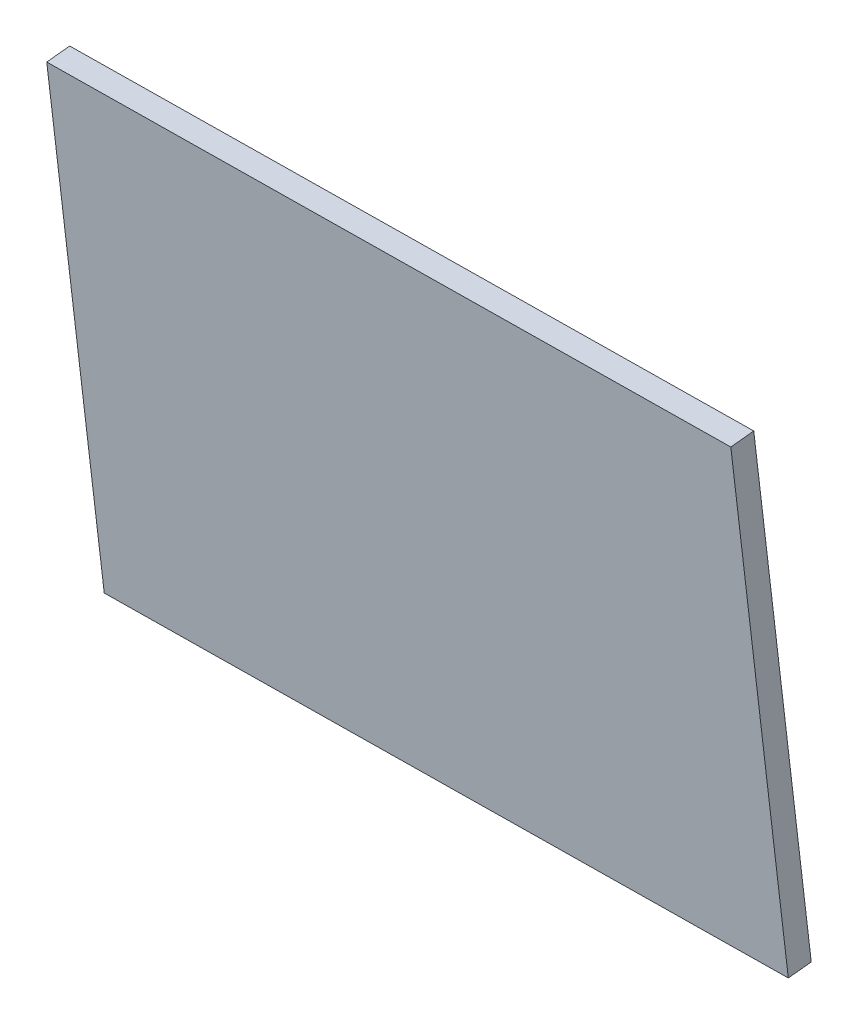
ISO-10303-21;
HEADER;
FILE_DESCRIPTION(('STEP AP214'),'2;1');
FILE_NAME('part.step','',(''),(''),'','','');
FILE_SCHEMA(('AUTOMOTIVE_DESIGN { 1 0 10303 214 1 1 1 1 }'));
ENDSEC;
DATA;
#1=APPLICATION_CONTEXT('core data for automotive mechanical design processes');
#2=APPLICATION_PROTOCOL_DEFINITION('international standard','automotive_design',2000,#1);
#3=PRODUCT_CONTEXT('',#1,'mechanical');
#4=PRODUCT('Part','Part','',(#3));
#5=PRODUCT_RELATED_PRODUCT_CATEGORY('part','',(#4));
#6=PRODUCT_DEFINITION_FORMATION('','',#4);
#7=PRODUCT_DEFINITION_CONTEXT('part definition',#1,'design');
#8=PRODUCT_DEFINITION('design','',#6,#7);
#9=PRODUCT_DEFINITION_SHAPE('','',#8);
#10=(LENGTH_UNIT() NAMED_UNIT(*) SI_UNIT(.MILLI.,.METRE.));
#11=(NAMED_UNIT(*) PLANE_ANGLE_UNIT() SI_UNIT($,.RADIAN.));
#12=(NAMED_UNIT(*) SI_UNIT($,.STERADIAN.) SOLID_ANGLE_UNIT());
#13=UNCERTAINTY_MEASURE_WITH_UNIT(LENGTH_MEASURE(1.E-05),#10,'distance_accuracy_value','');
#14=(GEOMETRIC_REPRESENTATION_CONTEXT(3) GLOBAL_UNCERTAINTY_ASSIGNED_CONTEXT((#13)) GLOBAL_UNIT_ASSIGNED_CONTEXT((#10,
#11,#12)) REPRESENTATION_CONTEXT('',''));
#15=CARTESIAN_POINT('',(0.,0.,0.));
#16=DIRECTION('',(0.,0.,1.));
#17=DIRECTION('',(1.,0.,0.));
#18=AXIS2_PLACEMENT_3D('',#15,#16,#17);
#19=CARTESIAN_POINT('',(442.900543352391,-883.331970053048,-294.85059116165));
#20=DIRECTION('',(0.999899544381668,0.0140963136781498,0.00148158226920728));
#21=DIRECTION('',(-0.0140963291494858,0.99990064181623,0.));
#22=AXIS2_PLACEMENT_3D('',#19,#20,#21);
#23=PLANE('',#22);
#24=DIRECTION('',(0.0141739601147041,-0.994421990056329,-0.104517962796242));
#25=VECTOR('',#24,1.);
#26=CARTESIAN_POINT('',(442.900543352391,-882.286685420371,-304.795810115332));
#27=LINE('',#26,#25);
#28=CARTESIAN_POINT('',(439.924011728303,-673.458067508544,-282.847037928122));
#29=VERTEX_POINT('',#28);
#30=CARTESIAN_POINT('',(442.900543352391,-882.286685420371,-304.795810115332));
#31=VERTEX_POINT('',#30);
#32=EDGE_CURVE('E103',#29,#31,#27,.T.);
#33=ORIENTED_EDGE('',*,*,#32,.F.);
#34=DIRECTION('',(0.,0.104528463267653,-0.994521895368273));
#35=VECTOR('',#34,1.);
#36=CARTESIAN_POINT('',(439.924011728303,-674.50335214122,-272.901818974439));
#37=LINE('',#36,#35);
#38=CARTESIAN_POINT('',(439.924011728303,-674.50335214122,-272.901818974439));
#39=VERTEX_POINT('',#38);
#40=EDGE_CURVE('E11',#39,#29,#37,.T.);
#41=ORIENTED_EDGE('',*,*,#40,.F.);
#42=DIRECTION('',(0.0141739601147041,-0.994421990056329,-0.104517962796242));
#43=VECTOR('',#42,1.);
#44=CARTESIAN_POINT('',(442.900543352391,-883.331970053048,-294.85059116165));
#45=LINE('',#44,#43);
#46=CARTESIAN_POINT('',(442.900543352391,-883.331970053048,-294.85059116165));
#47=VERTEX_POINT('',#46);
#48=EDGE_CURVE('E97',#39,#47,#45,.T.);
#49=ORIENTED_EDGE('',*,*,#48,.T.);
#50=DIRECTION('',(0.,0.104528463267653,-0.994521895368273));
#51=VECTOR('',#50,1.);
#52=CARTESIAN_POINT('',(442.900543352391,-883.331970053048,-294.85059116165));
#53=LINE('',#52,#51);
#54=EDGE_CURVE('E42',#47,#31,#53,.T.);
#55=ORIENTED_EDGE('',*,*,#54,.T.);
#56=EDGE_LOOP('',(#33,#41,#49,#55));
#57=FACE_BOUND('',#56,.T.);
#58=ADVANCED_FACE('F39',(#57),#23,.T.);
#59=CARTESIAN_POINT('',(439.924011728303,-674.50335214122,-272.901818974439));
#60=DIRECTION('',(-0.014173960114696,0.994421990056329,0.104517962796242));
#61=DIRECTION('',(0.,-0.104528463267653,0.994521895368273));
#62=AXIS2_PLACEMENT_3D('',#59,#60,#61);
#63=PLANE('',#62);
#64=DIRECTION('',(0.999899544381668,0.0140963136781417,0.00148158226920643));
#65=VECTOR('',#64,1.);
#66=CARTESIAN_POINT('',(439.924011728303,-673.458067508544,-282.847037928122));
#67=LINE('',#66,#65);
#68=CARTESIAN_POINT('',(142.953847046948,-677.644672670952,-283.287067862076));
#69=VERTEX_POINT('',#68);
#70=EDGE_CURVE('E99',#69,#29,#67,.T.);
#71=ORIENTED_EDGE('',*,*,#70,.F.);
#72=DIRECTION('',(0.,0.104528463267653,-0.994521895368273));
#73=VECTOR('',#72,1.);
#74=CARTESIAN_POINT('',(142.953847046948,-678.689957303628,-273.341848908393));
#75=LINE('',#74,#73);
#76=CARTESIAN_POINT('',(142.953847046948,-678.689957303628,-273.341848908393));
#77=VERTEX_POINT('',#76);
#78=EDGE_CURVE('E48',#77,#69,#75,.T.);
#79=ORIENTED_EDGE('',*,*,#78,.F.);
#80=DIRECTION('',(0.999899544381668,0.0140963136781417,0.00148158226920643));
#81=VECTOR('',#80,1.);
#82=CARTESIAN_POINT('',(439.924011728303,-674.50335214122,-272.901818974439));
#83=LINE('',#82,#81);
#84=EDGE_CURVE('E94',#77,#39,#83,.T.);
#85=ORIENTED_EDGE('',*,*,#84,.T.);
#86=ORIENTED_EDGE('',*,*,#40,.T.);
#87=EDGE_LOOP('',(#71,#79,#85,#86));
#88=FACE_BOUND('',#87,.T.);
#89=ADVANCED_FACE('F113',(#88),#63,.T.);
#90=CARTESIAN_POINT('',(142.953847046948,-678.689957303628,-273.341848908393));
#91=DIRECTION('',(-0.999899544381668,-0.0140963136781502,-0.00148158226920732));
#92=DIRECTION('',(0.0140963291494862,-0.99990064181623,0.));
#93=AXIS2_PLACEMENT_3D('',#90,#91,#92);
#94=PLANE('',#93);
#95=DIRECTION('',(-0.0141739601147045,0.994421990056329,0.104517962796242));
#96=VECTOR('',#95,1.);
#97=CARTESIAN_POINT('',(142.953847046948,-677.644672670952,-283.287067862076));
#98=LINE('',#97,#96);
#99=CARTESIAN_POINT('',(145.930378671036,-886.473290582781,-305.235840049287));
#100=VERTEX_POINT('',#99);
#101=EDGE_CURVE('E89',#100,#69,#98,.T.);
#102=ORIENTED_EDGE('',*,*,#101,.F.);
#103=DIRECTION('',(0.,0.104528463267653,-0.994521895368273));
#104=VECTOR('',#103,1.);
#105=CARTESIAN_POINT('',(145.930378671036,-887.518575215458,-295.290621095604));
#106=LINE('',#105,#104);
#107=CARTESIAN_POINT('',(145.930378671036,-887.518575215458,-295.290621095604));
#108=VERTEX_POINT('',#107);
#109=EDGE_CURVE('E84',#108,#100,#106,.T.);
#110=ORIENTED_EDGE('',*,*,#109,.F.);
#111=DIRECTION('',(-0.0141739601147045,0.994421990056329,0.104517962796242));
#112=VECTOR('',#111,1.);
#113=CARTESIAN_POINT('',(142.953847046948,-678.689957303628,-273.341848908393));
#114=LINE('',#113,#112);
#115=EDGE_CURVE('E87',#108,#77,#114,.T.);
#116=ORIENTED_EDGE('',*,*,#115,.T.);
#117=ORIENTED_EDGE('',*,*,#78,.T.);
#118=EDGE_LOOP('',(#102,#110,#116,#117));
#119=FACE_BOUND('',#118,.T.);
#120=ADVANCED_FACE('F86',(#119),#94,.T.);
#121=CARTESIAN_POINT('',(145.930378671036,-887.518575215458,-295.290621095604));
#122=DIRECTION('',(0.014173960114702,-0.994421990056329,-0.104517962796242));
#123=DIRECTION('',(0.,0.104528463267653,-0.994521895368273));
#124=AXIS2_PLACEMENT_3D('',#121,#122,#123);
#125=PLANE('',#124);
#126=DIRECTION('',(-0.999899544381668,-0.0140963136781477,-0.001481582269207));
#127=VECTOR('',#126,1.);
#128=CARTESIAN_POINT('',(145.930378671036,-886.473290582781,-305.235840049287));
#129=LINE('',#128,#127);
#130=EDGE_CURVE('E106',#31,#100,#129,.T.);
#131=ORIENTED_EDGE('',*,*,#130,.F.);
#132=ORIENTED_EDGE('',*,*,#54,.F.);
#133=DIRECTION('',(-0.999899544381668,-0.0140963136781477,-0.001481582269207));
#134=VECTOR('',#133,1.);
#135=CARTESIAN_POINT('',(145.930378671036,-887.518575215458,-295.290621095604));
#136=LINE('',#135,#134);
#137=EDGE_CURVE('E93',#47,#108,#136,.T.);
#138=ORIENTED_EDGE('',*,*,#137,.T.);
#139=ORIENTED_EDGE('',*,*,#109,.T.);
#140=EDGE_LOOP('',(#131,#132,#138,#139));
#141=FACE_BOUND('',#140,.T.);
#142=ADVANCED_FACE('F96',(#141),#125,.T.);
#143=CARTESIAN_POINT('',(0.,20.9999810264206,-199.801473017125));
#144=DIRECTION('',(0.,-0.104528463267653,0.994521895368273));
#145=DIRECTION('',(0.,-0.994521895368273,-0.104528463267653));
#146=AXIS2_PLACEMENT_3D('',#143,#144,#145);
#147=PLANE('',#146);
#148=ORIENTED_EDGE('',*,*,#48,.F.);
#149=ORIENTED_EDGE('',*,*,#84,.F.);
#150=ORIENTED_EDGE('',*,*,#115,.F.);
#151=ORIENTED_EDGE('',*,*,#137,.F.);
#152=EDGE_LOOP('',(#148,#149,#150,#151));
#153=FACE_BOUND('',#152,.T.);
#154=ADVANCED_FACE('F92',(#153),#147,.T.);
#155=CARTESIAN_POINT('',(0.,22.0452656590971,-209.746691970808));
#156=DIRECTION('',(0.,-0.104528463267653,0.994521895368273));
#157=DIRECTION('',(0.,-0.994521895368273,-0.104528463267653));
#158=AXIS2_PLACEMENT_3D('',#155,#156,#157);
#159=PLANE('',#158);
#160=ORIENTED_EDGE('',*,*,#32,.T.);
#161=ORIENTED_EDGE('',*,*,#130,.T.);
#162=ORIENTED_EDGE('',*,*,#101,.T.);
#163=ORIENTED_EDGE('',*,*,#70,.T.);
#164=EDGE_LOOP('',(#160,#161,#162,#163));
#165=FACE_BOUND('',#164,.T.);
#166=ADVANCED_FACE('F112',(#165),#159,.F.);
#167=CLOSED_SHELL('',(#58,#89,#120,#142,#154,#166));
#168=MANIFOLD_SOLID_BREP('B2',#167);
#169=ADVANCED_BREP_SHAPE_REPRESENTATION('',(#18,#168),#14);
#170=SHAPE_DEFINITION_REPRESENTATION(#9,#169);
ENDSEC;
END-ISO-10303-21;
